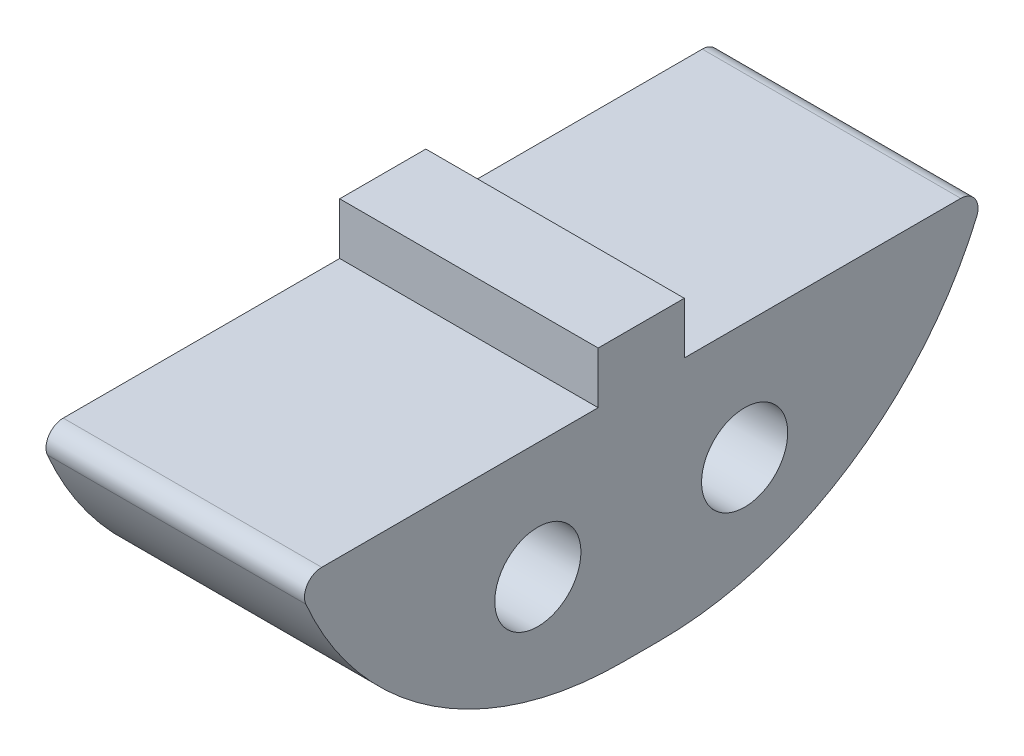
ISO-10303-21;
HEADER;
FILE_DESCRIPTION(('STEP AP214'),'2;1');
FILE_NAME('part.step','',(''),(''),'','','');
FILE_SCHEMA(('AUTOMOTIVE_DESIGN { 1 0 10303 214 1 1 1 1 }'));
ENDSEC;
DATA;
#1=APPLICATION_CONTEXT('core data for automotive mechanical design processes');
#2=APPLICATION_PROTOCOL_DEFINITION('international standard','automotive_design',2000,#1);
#3=PRODUCT_CONTEXT('',#1,'mechanical');
#4=PRODUCT('Part','Part','',(#3));
#5=PRODUCT_RELATED_PRODUCT_CATEGORY('part','',(#4));
#6=PRODUCT_DEFINITION_FORMATION('','',#4);
#7=PRODUCT_DEFINITION_CONTEXT('part definition',#1,'design');
#8=PRODUCT_DEFINITION('design','',#6,#7);
#9=PRODUCT_DEFINITION_SHAPE('','',#8);
#10=(LENGTH_UNIT() NAMED_UNIT(*) SI_UNIT(.MILLI.,.METRE.));
#11=(NAMED_UNIT(*) PLANE_ANGLE_UNIT() SI_UNIT($,.RADIAN.));
#12=(NAMED_UNIT(*) SI_UNIT($,.STERADIAN.) SOLID_ANGLE_UNIT());
#13=UNCERTAINTY_MEASURE_WITH_UNIT(LENGTH_MEASURE(1.E-05),#10,'distance_accuracy_value','');
#14=(GEOMETRIC_REPRESENTATION_CONTEXT(3) GLOBAL_UNCERTAINTY_ASSIGNED_CONTEXT((#13)) GLOBAL_UNIT_ASSIGNED_CONTEXT((#10,
#11,#12)) REPRESENTATION_CONTEXT('',''));
#15=CARTESIAN_POINT('',(0.,0.,0.));
#16=DIRECTION('',(0.,0.,1.));
#17=DIRECTION('',(1.,0.,0.));
#18=AXIS2_PLACEMENT_3D('',#15,#16,#17);
#19=CARTESIAN_POINT('',(15.,27.,40.));
#20=DIRECTION('',(-1.,0.,0.));
#21=DIRECTION('',(0.,0.,1.));
#22=AXIS2_PLACEMENT_3D('',#19,#20,#21);
#23=PLANE('',#22);
#24=DIRECTION('',(0.,0.,-1.));
#25=VECTOR('',#24,1.);
#26=CARTESIAN_POINT('',(15.,27.,40.));
#27=LINE('',#26,#25);
#28=CARTESIAN_POINT('',(15.,27.,37.0856198614367));
#29=VERTEX_POINT('',#28);
#30=CARTESIAN_POINT('',(15.,27.,5.));
#31=VERTEX_POINT('',#30);
#32=EDGE_CURVE('E151',#29,#31,#27,.T.);
#33=ORIENTED_EDGE('',*,*,#32,.F.);
#34=CARTESIAN_POINT('',(15.,25.,37.0856198614367));
#35=DIRECTION('',(-1.,0.,0.));
#36=DIRECTION('',(0.,0.,1.));
#37=AXIS2_PLACEMENT_3D('',#34,#35,#36);
#38=CIRCLE('',#37,2.);
#39=CARTESIAN_POINT('',(15.,24.2105263157895,38.9232083088152));
#40=VERTEX_POINT('',#39);
#41=EDGE_CURVE('E64',#29,#40,#38,.F.);
#42=ORIENTED_EDGE('',*,*,#41,.T.);
#43=CARTESIAN_POINT('',(15.,40.,2.17143936124452));
#44=DIRECTION('',(-1.,0.,0.));
#45=DIRECTION('',(0.,0.,1.));
#46=AXIS2_PLACEMENT_3D('',#43,#44,#45);
#47=CIRCLE('',#46,40.);
#48=CARTESIAN_POINT('',(15.,0.,2.17143936124452));
#49=VERTEX_POINT('',#48);
#50=EDGE_CURVE('E174',#40,#49,#47,.F.);
#51=ORIENTED_EDGE('',*,*,#50,.T.);
#52=DIRECTION('',(0.,0.,-1.));
#53=VECTOR('',#52,1.);
#54=CARTESIAN_POINT('',(15.,0.,40.));
#55=LINE('',#54,#53);
#56=CARTESIAN_POINT('',(15.,0.,-2.17143936124452));
#57=VERTEX_POINT('',#56);
#58=EDGE_CURVE('E143',#49,#57,#55,.T.);
#59=ORIENTED_EDGE('',*,*,#58,.T.);
#60=CARTESIAN_POINT('',(15.,40.,-2.17143936124452));
#61=DIRECTION('',(-1.,0.,0.));
#62=DIRECTION('',(0.,0.,1.));
#63=AXIS2_PLACEMENT_3D('',#60,#61,#62);
#64=CIRCLE('',#63,40.);
#65=CARTESIAN_POINT('',(15.,24.2105263157895,-38.9232083088152));
#66=VERTEX_POINT('',#65);
#67=EDGE_CURVE('E169',#57,#66,#64,.F.);
#68=ORIENTED_EDGE('',*,*,#67,.T.);
#69=CARTESIAN_POINT('',(15.,25.,-37.0856198614367));
#70=DIRECTION('',(-1.,0.,0.));
#71=DIRECTION('',(0.,0.,1.));
#72=AXIS2_PLACEMENT_3D('',#69,#70,#71);
#73=CIRCLE('',#72,2.);
#74=CARTESIAN_POINT('',(15.,27.,-37.0856198614367));
#75=VERTEX_POINT('',#74);
#76=EDGE_CURVE('E183',#66,#75,#73,.F.);
#77=ORIENTED_EDGE('',*,*,#76,.T.);
#78=CARTESIAN_POINT('',(15.,27.,-5.));
#79=VERTEX_POINT('',#78);
#80=EDGE_CURVE('E142',#79,#75,#27,.T.);
#81=ORIENTED_EDGE('',*,*,#80,.F.);
#82=DIRECTION('',(0.,-1.,0.));
#83=VECTOR('',#82,1.);
#84=CARTESIAN_POINT('',(15.,33.,-5.));
#85=LINE('',#84,#83);
#86=CARTESIAN_POINT('',(15.,33.,-5.));
#87=VERTEX_POINT('',#86);
#88=EDGE_CURVE('E123',#87,#79,#85,.T.);
#89=ORIENTED_EDGE('',*,*,#88,.F.);
#90=DIRECTION('',(0.,0.,-1.));
#91=VECTOR('',#90,1.);
#92=CARTESIAN_POINT('',(15.,33.,5.));
#93=LINE('',#92,#91);
#94=CARTESIAN_POINT('',(15.,33.,5.));
#95=VERTEX_POINT('',#94);
#96=EDGE_CURVE('E129',#95,#87,#93,.T.);
#97=ORIENTED_EDGE('',*,*,#96,.F.);
#98=DIRECTION('',(0.,-1.,0.));
#99=VECTOR('',#98,1.);
#100=CARTESIAN_POINT('',(15.,33.,5.));
#101=LINE('',#100,#99);
#102=EDGE_CURVE('E200',#95,#31,#101,.T.);
#103=ORIENTED_EDGE('',*,*,#102,.T.);
#104=EDGE_LOOP('',(#33,#42,#51,#59,#68,#77,#81,#89,#97,#103));
#105=FACE_BOUND('',#104,.T.);
#106=CARTESIAN_POINT('',(15.,13.5,-12.));
#107=DIRECTION('',(-1.,0.,0.));
#108=DIRECTION('',(0.,0.,1.));
#109=AXIS2_PLACEMENT_3D('',#106,#107,#108);
#110=CIRCLE('',#109,5.);
#111=CARTESIAN_POINT('',(15.,13.5,-7.));
#112=VERTEX_POINT('',#111);
#113=EDGE_CURVE('E209',#112,#112,#110,.T.);
#114=ORIENTED_EDGE('',*,*,#113,.T.);
#115=EDGE_LOOP('',(#114));
#116=FACE_BOUND('',#115,.T.);
#117=CARTESIAN_POINT('',(15.,13.5,12.));
#118=DIRECTION('',(1.,0.,0.));
#119=DIRECTION('',(0.,0.,-1.));
#120=AXIS2_PLACEMENT_3D('',#117,#118,#119);
#121=CIRCLE('',#120,5.);
#122=CARTESIAN_POINT('',(15.,13.5,7.));
#123=VERTEX_POINT('',#122);
#124=EDGE_CURVE('E163',#123,#123,#121,.T.);
#125=ORIENTED_EDGE('',*,*,#124,.F.);
#126=EDGE_LOOP('',(#125));
#127=FACE_BOUND('',#126,.T.);
#128=ADVANCED_FACE('F42',(#105,#116,#127),#23,.F.);
#129=CARTESIAN_POINT('',(-15.,27.,40.));
#130=DIRECTION('',(-1.,0.,0.));
#131=DIRECTION('',(0.,0.,1.));
#132=AXIS2_PLACEMENT_3D('',#129,#130,#131);
#133=PLANE('',#132);
#134=CARTESIAN_POINT('',(-15.,13.5,-12.));
#135=DIRECTION('',(-1.,0.,0.));
#136=DIRECTION('',(0.,0.,1.));
#137=AXIS2_PLACEMENT_3D('',#134,#135,#136);
#138=CIRCLE('',#137,5.);
#139=CARTESIAN_POINT('',(-15.,13.5,-7.));
#140=VERTEX_POINT('',#139);
#141=EDGE_CURVE('E159',#140,#140,#138,.F.);
#142=ORIENTED_EDGE('',*,*,#141,.T.);
#143=EDGE_LOOP('',(#142));
#144=FACE_BOUND('',#143,.T.);
#145=CARTESIAN_POINT('',(-15.,40.,2.17143936124452));
#146=DIRECTION('',(-1.,0.,0.));
#147=DIRECTION('',(0.,0.,1.));
#148=AXIS2_PLACEMENT_3D('',#145,#146,#147);
#149=CIRCLE('',#148,40.);
#150=CARTESIAN_POINT('',(-15.,0.,2.17143936124452));
#151=VERTEX_POINT('',#150);
#152=CARTESIAN_POINT('',(-15.,24.2105263157895,38.9232083088152));
#153=VERTEX_POINT('',#152);
#154=EDGE_CURVE('E178',#151,#153,#149,.T.);
#155=ORIENTED_EDGE('',*,*,#154,.T.);
#156=CARTESIAN_POINT('',(-15.,25.,37.0856198614367));
#157=DIRECTION('',(-1.,0.,0.));
#158=DIRECTION('',(0.,0.,1.));
#159=AXIS2_PLACEMENT_3D('',#156,#157,#158);
#160=CIRCLE('',#159,2.);
#161=CARTESIAN_POINT('',(-15.,27.,37.0856198614367));
#162=VERTEX_POINT('',#161);
#163=EDGE_CURVE('E11',#153,#162,#160,.T.);
#164=ORIENTED_EDGE('',*,*,#163,.T.);
#165=DIRECTION('',(0.,0.,-1.));
#166=VECTOR('',#165,1.);
#167=CARTESIAN_POINT('',(-15.,27.,40.));
#168=LINE('',#167,#166);
#169=CARTESIAN_POINT('',(-15.,27.,5.));
#170=VERTEX_POINT('',#169);
#171=EDGE_CURVE('E154',#162,#170,#168,.T.);
#172=ORIENTED_EDGE('',*,*,#171,.T.);
#173=DIRECTION('',(0.,-1.,0.));
#174=VECTOR('',#173,1.);
#175=CARTESIAN_POINT('',(-15.,33.,5.));
#176=LINE('',#175,#174);
#177=CARTESIAN_POINT('',(-15.,33.,5.));
#178=VERTEX_POINT('',#177);
#179=EDGE_CURVE('E147',#178,#170,#176,.T.);
#180=ORIENTED_EDGE('',*,*,#179,.F.);
#181=DIRECTION('',(0.,0.,1.));
#182=VECTOR('',#181,1.);
#183=CARTESIAN_POINT('',(-15.,33.,5.));
#184=LINE('',#183,#182);
#185=CARTESIAN_POINT('',(-15.,33.,-5.));
#186=VERTEX_POINT('',#185);
#187=EDGE_CURVE('E128',#186,#178,#184,.T.);
#188=ORIENTED_EDGE('',*,*,#187,.F.);
#189=DIRECTION('',(0.,-1.,0.));
#190=VECTOR('',#189,1.);
#191=CARTESIAN_POINT('',(-15.,33.,-5.));
#192=LINE('',#191,#190);
#193=CARTESIAN_POINT('',(-15.,27.,-5.));
#194=VERTEX_POINT('',#193);
#195=EDGE_CURVE('E125',#186,#194,#192,.T.);
#196=ORIENTED_EDGE('',*,*,#195,.T.);
#197=CARTESIAN_POINT('',(-15.,27.,-37.0856198614367));
#198=VERTEX_POINT('',#197);
#199=EDGE_CURVE('E153',#194,#198,#168,.T.);
#200=ORIENTED_EDGE('',*,*,#199,.T.);
#201=CARTESIAN_POINT('',(-15.,25.,-37.0856198614367));
#202=DIRECTION('',(-1.,0.,0.));
#203=DIRECTION('',(0.,0.,1.));
#204=AXIS2_PLACEMENT_3D('',#201,#202,#203);
#205=CIRCLE('',#204,2.);
#206=CARTESIAN_POINT('',(-15.,24.2105263157895,-38.9232083088152));
#207=VERTEX_POINT('',#206);
#208=EDGE_CURVE('E187',#198,#207,#205,.T.);
#209=ORIENTED_EDGE('',*,*,#208,.T.);
#210=CARTESIAN_POINT('',(-15.,40.,-2.17143936124452));
#211=DIRECTION('',(-1.,0.,0.));
#212=DIRECTION('',(0.,0.,1.));
#213=AXIS2_PLACEMENT_3D('',#210,#211,#212);
#214=CIRCLE('',#213,40.);
#215=CARTESIAN_POINT('',(-15.,0.,-2.17143936124452));
#216=VERTEX_POINT('',#215);
#217=EDGE_CURVE('E172',#207,#216,#214,.T.);
#218=ORIENTED_EDGE('',*,*,#217,.T.);
#219=DIRECTION('',(0.,0.,-1.));
#220=VECTOR('',#219,1.);
#221=CARTESIAN_POINT('',(-15.,0.,40.));
#222=LINE('',#221,#220);
#223=EDGE_CURVE('E145',#151,#216,#222,.T.);
#224=ORIENTED_EDGE('',*,*,#223,.F.);
#225=EDGE_LOOP('',(#155,#164,#172,#180,#188,#196,#200,#209,#218,#224));
#226=FACE_BOUND('',#225,.T.);
#227=CARTESIAN_POINT('',(-15.,13.5,12.));
#228=DIRECTION('',(-1.,0.,0.));
#229=DIRECTION('',(0.,0.,1.));
#230=AXIS2_PLACEMENT_3D('',#227,#228,#229);
#231=CIRCLE('',#230,5.);
#232=CARTESIAN_POINT('',(-15.,13.5,17.));
#233=VERTEX_POINT('',#232);
#234=EDGE_CURVE('E162',#233,#233,#231,.T.);
#235=ORIENTED_EDGE('',*,*,#234,.F.);
#236=EDGE_LOOP('',(#235));
#237=FACE_BOUND('',#236,.T.);
#238=ADVANCED_FACE('F218',(#144,#226,#237),#133,.T.);
#239=CARTESIAN_POINT('',(0.,27.,0.));
#240=DIRECTION('',(0.,1.,0.));
#241=DIRECTION('',(0.,0.,1.));
#242=AXIS2_PLACEMENT_3D('',#239,#240,#241);
#243=PLANE('',#242);
#244=ORIENTED_EDGE('',*,*,#171,.F.);
#245=DIRECTION('',(1.,0.,0.));
#246=VECTOR('',#245,1.);
#247=CARTESIAN_POINT('',(0.,27.,37.0856198614367));
#248=LINE('',#247,#246);
#249=EDGE_CURVE('E189',#162,#29,#248,.T.);
#250=ORIENTED_EDGE('',*,*,#249,.T.);
#251=ORIENTED_EDGE('',*,*,#32,.T.);
#252=DIRECTION('',(1.,0.,0.));
#253=VECTOR('',#252,1.);
#254=CARTESIAN_POINT('',(-15.,27.,5.));
#255=LINE('',#254,#253);
#256=EDGE_CURVE('E137',#170,#31,#255,.T.);
#257=ORIENTED_EDGE('',*,*,#256,.F.);
#258=EDGE_LOOP('',(#244,#250,#251,#257));
#259=FACE_BOUND('',#258,.T.);
#260=ADVANCED_FACE('F195',(#259),#243,.T.);
#261=ORIENTED_EDGE('',*,*,#80,.T.);
#262=DIRECTION('',(1.,0.,0.));
#263=VECTOR('',#262,1.);
#264=CARTESIAN_POINT('',(0.,27.,-37.0856198614367));
#265=LINE('',#264,#263);
#266=EDGE_CURVE('E185',#75,#198,#265,.F.);
#267=ORIENTED_EDGE('',*,*,#266,.T.);
#268=ORIENTED_EDGE('',*,*,#199,.F.);
#269=DIRECTION('',(-1.,0.,0.));
#270=VECTOR('',#269,1.);
#271=CARTESIAN_POINT('',(-15.,27.,-5.));
#272=LINE('',#271,#270);
#273=EDGE_CURVE('E166',#79,#194,#272,.T.);
#274=ORIENTED_EDGE('',*,*,#273,.F.);
#275=EDGE_LOOP('',(#261,#267,#268,#274));
#276=FACE_BOUND('',#275,.T.);
#277=ADVANCED_FACE('F266',(#276),#243,.T.);
#278=CARTESIAN_POINT('',(0.,0.,0.));
#279=DIRECTION('',(0.,1.,0.));
#280=DIRECTION('',(0.,0.,1.));
#281=AXIS2_PLACEMENT_3D('',#278,#279,#280);
#282=PLANE('',#281);
#283=ORIENTED_EDGE('',*,*,#58,.F.);
#284=DIRECTION('',(1.,0.,0.));
#285=VECTOR('',#284,1.);
#286=CARTESIAN_POINT('',(0.,0.,2.17143936124452));
#287=LINE('',#286,#285);
#288=EDGE_CURVE('E176',#49,#151,#287,.F.);
#289=ORIENTED_EDGE('',*,*,#288,.T.);
#290=ORIENTED_EDGE('',*,*,#223,.T.);
#291=DIRECTION('',(1.,0.,0.));
#292=VECTOR('',#291,1.);
#293=CARTESIAN_POINT('',(0.,0.,-2.17143936124452));
#294=LINE('',#293,#292);
#295=EDGE_CURVE('E155',#216,#57,#294,.T.);
#296=ORIENTED_EDGE('',*,*,#295,.T.);
#297=EDGE_LOOP('',(#283,#289,#290,#296));
#298=FACE_BOUND('',#297,.T.);
#299=ADVANCED_FACE('F251',(#298),#282,.F.);
#300=CARTESIAN_POINT('',(-15.,33.,-5.));
#301=DIRECTION('',(0.,0.,1.));
#302=DIRECTION('',(1.,0.,0.));
#303=AXIS2_PLACEMENT_3D('',#300,#301,#302);
#304=PLANE('',#303);
#305=ORIENTED_EDGE('',*,*,#273,.T.);
#306=ORIENTED_EDGE('',*,*,#195,.F.);
#307=DIRECTION('',(-1.,0.,0.));
#308=VECTOR('',#307,1.);
#309=CARTESIAN_POINT('',(-15.,33.,-5.));
#310=LINE('',#309,#308);
#311=EDGE_CURVE('E118',#87,#186,#310,.T.);
#312=ORIENTED_EDGE('',*,*,#311,.F.);
#313=ORIENTED_EDGE('',*,*,#88,.T.);
#314=EDGE_LOOP('',(#305,#306,#312,#313));
#315=FACE_BOUND('',#314,.T.);
#316=ADVANCED_FACE('F121',(#315),#304,.F.);
#317=CARTESIAN_POINT('',(-15.,33.,5.));
#318=DIRECTION('',(0.,0.,-1.));
#319=DIRECTION('',(-1.,0.,0.));
#320=AXIS2_PLACEMENT_3D('',#317,#318,#319);
#321=PLANE('',#320);
#322=ORIENTED_EDGE('',*,*,#256,.T.);
#323=ORIENTED_EDGE('',*,*,#102,.F.);
#324=DIRECTION('',(1.,0.,0.));
#325=VECTOR('',#324,1.);
#326=CARTESIAN_POINT('',(-15.,33.,5.));
#327=LINE('',#326,#325);
#328=EDGE_CURVE('E134',#178,#95,#327,.T.);
#329=ORIENTED_EDGE('',*,*,#328,.F.);
#330=ORIENTED_EDGE('',*,*,#179,.T.);
#331=EDGE_LOOP('',(#322,#323,#329,#330));
#332=FACE_BOUND('',#331,.T.);
#333=ADVANCED_FACE('F254',(#332),#321,.F.);
#334=CARTESIAN_POINT('',(0.,33.,0.));
#335=DIRECTION('',(0.,-1.,0.));
#336=DIRECTION('',(0.,0.,-1.));
#337=AXIS2_PLACEMENT_3D('',#334,#335,#336);
#338=PLANE('',#337);
#339=ORIENTED_EDGE('',*,*,#96,.T.);
#340=ORIENTED_EDGE('',*,*,#311,.T.);
#341=ORIENTED_EDGE('',*,*,#187,.T.);
#342=ORIENTED_EDGE('',*,*,#328,.T.);
#343=EDGE_LOOP('',(#339,#340,#341,#342));
#344=FACE_BOUND('',#343,.T.);
#345=ADVANCED_FACE('F132',(#344),#338,.F.);
#346=CARTESIAN_POINT('',(-25.,13.5,-12.));
#347=DIRECTION('',(1.,0.,0.));
#348=DIRECTION('',(0.,0.,-1.));
#349=AXIS2_PLACEMENT_3D('',#346,#347,#348);
#350=CYLINDRICAL_SURFACE('',#349,5.);
#351=ORIENTED_EDGE('',*,*,#141,.F.);
#352=EDGE_LOOP('',(#351));
#353=FACE_BOUND('',#352,.T.);
#354=ORIENTED_EDGE('',*,*,#113,.F.);
#355=EDGE_LOOP('',(#354));
#356=FACE_BOUND('',#355,.T.);
#357=ADVANCED_FACE('F261',(#353,#356),#350,.F.);
#358=CARTESIAN_POINT('',(-25.,13.5,12.));
#359=DIRECTION('',(1.,0.,0.));
#360=DIRECTION('',(0.,0.,-1.));
#361=AXIS2_PLACEMENT_3D('',#358,#359,#360);
#362=CYLINDRICAL_SURFACE('',#361,5.);
#363=ORIENTED_EDGE('',*,*,#234,.T.);
#364=EDGE_LOOP('',(#363));
#365=FACE_BOUND('',#364,.T.);
#366=ORIENTED_EDGE('',*,*,#124,.T.);
#367=EDGE_LOOP('',(#366));
#368=FACE_BOUND('',#367,.T.);
#369=ADVANCED_FACE('F215',(#365,#368),#362,.F.);
#370=CARTESIAN_POINT('',(-15.,40.,-2.17143936124452));
#371=DIRECTION('',(1.,0.,0.));
#372=DIRECTION('',(0.,0.,-1.));
#373=AXIS2_PLACEMENT_3D('',#370,#371,#372);
#374=CYLINDRICAL_SURFACE('',#373,40.);
#375=ORIENTED_EDGE('',*,*,#217,.F.);
#376=DIRECTION('',(1.,0.,0.));
#377=VECTOR('',#376,1.);
#378=CARTESIAN_POINT('',(-15.,24.2105263157895,-38.9232083088152));
#379=LINE('',#378,#377);
#380=EDGE_CURVE('E180',#207,#66,#379,.T.);
#381=ORIENTED_EDGE('',*,*,#380,.T.);
#382=ORIENTED_EDGE('',*,*,#67,.F.);
#383=ORIENTED_EDGE('',*,*,#295,.F.);
#384=EDGE_LOOP('',(#375,#381,#382,#383));
#385=FACE_BOUND('',#384,.T.);
#386=ADVANCED_FACE('F227',(#385),#374,.T.);
#387=CARTESIAN_POINT('',(-15.,40.,2.17143936124452));
#388=DIRECTION('',(1.,0.,0.));
#389=DIRECTION('',(0.,0.,-1.));
#390=AXIS2_PLACEMENT_3D('',#387,#388,#389);
#391=CYLINDRICAL_SURFACE('',#390,40.);
#392=ORIENTED_EDGE('',*,*,#50,.F.);
#393=DIRECTION('',(1.,0.,0.));
#394=VECTOR('',#393,1.);
#395=CARTESIAN_POINT('',(-15.,24.2105263157895,38.9232083088152));
#396=LINE('',#395,#394);
#397=EDGE_CURVE('E50',#40,#153,#396,.F.);
#398=ORIENTED_EDGE('',*,*,#397,.T.);
#399=ORIENTED_EDGE('',*,*,#154,.F.);
#400=ORIENTED_EDGE('',*,*,#288,.F.);
#401=EDGE_LOOP('',(#392,#398,#399,#400));
#402=FACE_BOUND('',#401,.T.);
#403=ADVANCED_FACE('F230',(#402),#391,.T.);
#404=CARTESIAN_POINT('',(-15.,25.,-37.0856198614367));
#405=DIRECTION('',(1.,0.,0.));
#406=DIRECTION('',(0.,0.,-1.));
#407=AXIS2_PLACEMENT_3D('',#404,#405,#406);
#408=CYLINDRICAL_SURFACE('',#407,2.);
#409=ORIENTED_EDGE('',*,*,#208,.F.);
#410=ORIENTED_EDGE('',*,*,#266,.F.);
#411=ORIENTED_EDGE('',*,*,#76,.F.);
#412=ORIENTED_EDGE('',*,*,#380,.F.);
#413=EDGE_LOOP('',(#409,#410,#411,#412));
#414=FACE_BOUND('',#413,.T.);
#415=ADVANCED_FACE('F233',(#414),#408,.T.);
#416=CARTESIAN_POINT('',(-15.,25.,37.0856198614367));
#417=DIRECTION('',(1.,0.,0.));
#418=DIRECTION('',(0.,0.,-1.));
#419=AXIS2_PLACEMENT_3D('',#416,#417,#418);
#420=CYLINDRICAL_SURFACE('',#419,2.);
#421=ORIENTED_EDGE('',*,*,#163,.F.);
#422=ORIENTED_EDGE('',*,*,#397,.F.);
#423=ORIENTED_EDGE('',*,*,#41,.F.);
#424=ORIENTED_EDGE('',*,*,#249,.F.);
#425=EDGE_LOOP('',(#421,#422,#423,#424));
#426=FACE_BOUND('',#425,.T.);
#427=ADVANCED_FACE('F44',(#426),#420,.T.);
#428=CLOSED_SHELL('',(#128,#238,#260,#277,#299,#316,#333,#345,#357,#369,#386,#403,#415,#427));
#429=MANIFOLD_SOLID_BREP('B2',#428);
#430=ADVANCED_BREP_SHAPE_REPRESENTATION('',(#18,#429),#14);
#431=SHAPE_DEFINITION_REPRESENTATION(#9,#430);
ENDSEC;
END-ISO-10303-21;
